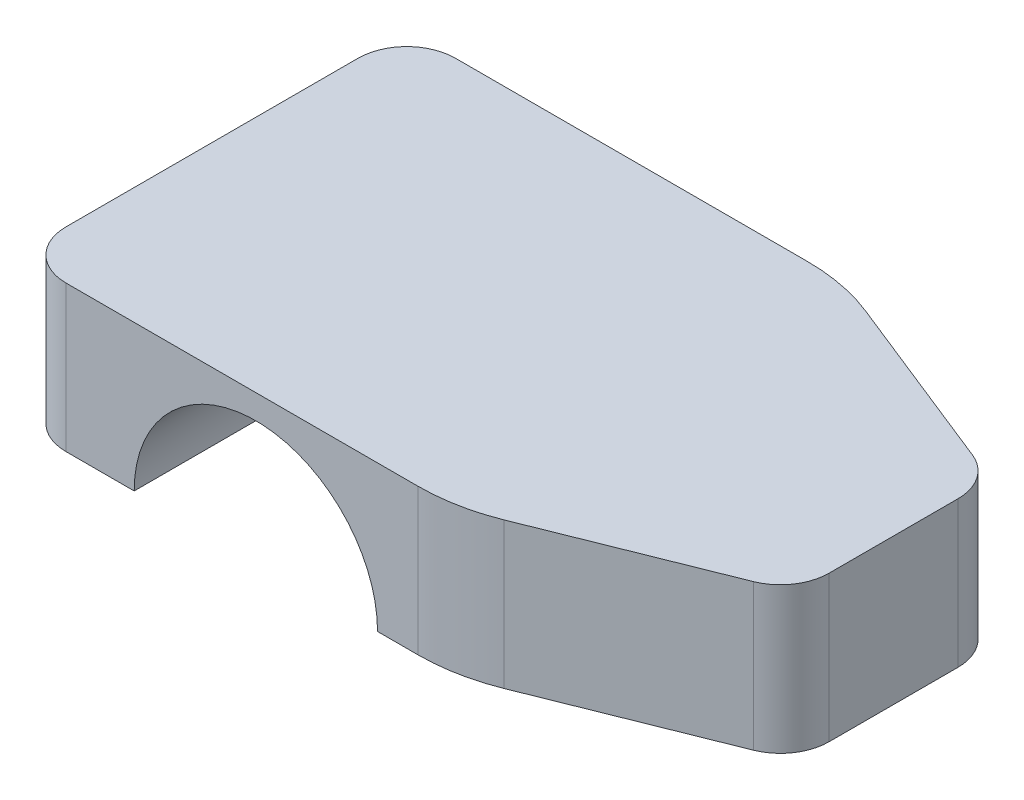
ISO-10303-21;
HEADER;
FILE_DESCRIPTION(('STEP AP214'),'2;1');
FILE_NAME('part.step','',(''),(''),'','','');
FILE_SCHEMA(('AUTOMOTIVE_DESIGN { 1 0 10303 214 1 1 1 1 }'));
ENDSEC;
DATA;
#1=APPLICATION_CONTEXT('core data for automotive mechanical design processes');
#2=APPLICATION_PROTOCOL_DEFINITION('international standard','automotive_design',2000,#1);
#3=PRODUCT_CONTEXT('',#1,'mechanical');
#4=PRODUCT('Part','Part','',(#3));
#5=PRODUCT_RELATED_PRODUCT_CATEGORY('part','',(#4));
#6=PRODUCT_DEFINITION_FORMATION('','',#4);
#7=PRODUCT_DEFINITION_CONTEXT('part definition',#1,'design');
#8=PRODUCT_DEFINITION('design','',#6,#7);
#9=PRODUCT_DEFINITION_SHAPE('','',#8);
#10=(LENGTH_UNIT() NAMED_UNIT(*) SI_UNIT(.MILLI.,.METRE.));
#11=(NAMED_UNIT(*) PLANE_ANGLE_UNIT() SI_UNIT($,.RADIAN.));
#12=(NAMED_UNIT(*) SI_UNIT($,.STERADIAN.) SOLID_ANGLE_UNIT());
#13=UNCERTAINTY_MEASURE_WITH_UNIT(LENGTH_MEASURE(1.E-05),#10,'distance_accuracy_value','');
#14=(GEOMETRIC_REPRESENTATION_CONTEXT(3) GLOBAL_UNCERTAINTY_ASSIGNED_CONTEXT((#13)) GLOBAL_UNIT_ASSIGNED_CONTEXT((#10,
#11,#12)) REPRESENTATION_CONTEXT('',''));
#15=CARTESIAN_POINT('',(0.,0.,0.));
#16=DIRECTION('',(0.,0.,1.));
#17=DIRECTION('',(1.,0.,0.));
#18=AXIS2_PLACEMENT_3D('',#15,#16,#17);
#19=CARTESIAN_POINT('',(0.,0.,0.));
#20=DIRECTION('',(0.,1.,0.));
#21=DIRECTION('',(0.,0.,1.));
#22=AXIS2_PLACEMENT_3D('',#19,#20,#21);
#23=PLANE('',#22);
#24=DIRECTION('',(1.,0.,0.));
#25=VECTOR('',#24,1.);
#26=CARTESIAN_POINT('',(-55.,0.,20.));
#27=LINE('',#26,#25);
#28=CARTESIAN_POINT('',(-50.,0.,20.));
#29=VERTEX_POINT('',#28);
#30=CARTESIAN_POINT('',(-43.,0.,20.));
#31=VERTEX_POINT('',#30);
#32=EDGE_CURVE('E158',#29,#31,#27,.T.);
#33=ORIENTED_EDGE('',*,*,#32,.F.);
#34=CARTESIAN_POINT('',(-50.,0.,15.));
#35=DIRECTION('',(0.,1.,0.));
#36=DIRECTION('',(0.,0.,1.));
#37=AXIS2_PLACEMENT_3D('',#34,#35,#36);
#38=CIRCLE('',#37,5.);
#39=CARTESIAN_POINT('',(-55.,0.,15.));
#40=VERTEX_POINT('',#39);
#41=EDGE_CURVE('E176',#29,#40,#38,.F.);
#42=ORIENTED_EDGE('',*,*,#41,.T.);
#43=DIRECTION('',(0.,0.,1.));
#44=VECTOR('',#43,1.);
#45=CARTESIAN_POINT('',(-55.,0.,-20.));
#46=LINE('',#45,#44);
#47=CARTESIAN_POINT('',(-55.,0.,-15.));
#48=VERTEX_POINT('',#47);
#49=EDGE_CURVE('E163',#48,#40,#46,.T.);
#50=ORIENTED_EDGE('',*,*,#49,.F.);
#51=CARTESIAN_POINT('',(-50.,0.,-15.));
#52=DIRECTION('',(0.,1.,0.));
#53=DIRECTION('',(0.,0.,1.));
#54=AXIS2_PLACEMENT_3D('',#51,#52,#53);
#55=CIRCLE('',#54,5.);
#56=CARTESIAN_POINT('',(-50.,0.,-20.));
#57=VERTEX_POINT('',#56);
#58=EDGE_CURVE('E174',#48,#57,#55,.F.);
#59=ORIENTED_EDGE('',*,*,#58,.T.);
#60=DIRECTION('',(-1.,0.,0.));
#61=VECTOR('',#60,1.);
#62=CARTESIAN_POINT('',(-55.,0.,-20.));
#63=LINE('',#62,#61);
#64=CARTESIAN_POINT('',(-43.,0.,-20.));
#65=VERTEX_POINT('',#64);
#66=EDGE_CURVE('E238',#65,#57,#63,.T.);
#67=ORIENTED_EDGE('',*,*,#66,.F.);
#68=DIRECTION('',(0.,0.,1.));
#69=VECTOR('',#68,1.);
#70=CARTESIAN_POINT('',(-43.,0.,-20.));
#71=LINE('',#70,#69);
#72=EDGE_CURVE('E151',#65,#31,#71,.T.);
#73=ORIENTED_EDGE('',*,*,#72,.T.);
#74=EDGE_LOOP('',(#33,#42,#50,#59,#67,#73));
#75=FACE_BOUND('',#74,.T.);
#76=ADVANCED_FACE('F39',(#75),#23,.F.);
#77=CARTESIAN_POINT('',(15.,15.,10.));
#78=DIRECTION('',(-0.371390676354103,0.,-0.928476690885259));
#79=DIRECTION('',(-0.92847669088526,0.,0.371390676354104));
#80=AXIS2_PLACEMENT_3D('',#77,#78,#79);
#81=PLANE('',#80);
#82=DIRECTION('',(0.928476690885259,0.,-0.371390676354103));
#83=VECTOR('',#82,1.);
#84=CARTESIAN_POINT('',(15.,15.,10.));
#85=LINE('',#84,#83);
#86=CARTESIAN_POINT('',(-6.42383454426297,15.,18.5695338177052));
#87=VERTEX_POINT('',#86);
#88=CARTESIAN_POINT('',(11.8569533817705,15.,11.2572186472918));
#89=VERTEX_POINT('',#88);
#90=EDGE_CURVE('E165',#87,#89,#85,.T.);
#91=ORIENTED_EDGE('',*,*,#90,.F.);
#92=DIRECTION('',(0.,-1.,0.));
#93=VECTOR('',#92,1.);
#94=CARTESIAN_POINT('',(-6.42383454426298,15.,18.5695338177052));
#95=LINE('',#94,#93);
#96=CARTESIAN_POINT('',(-6.42383454426297,0.,18.5695338177052));
#97=VERTEX_POINT('',#96);
#98=EDGE_CURVE('E47',#87,#97,#95,.T.);
#99=ORIENTED_EDGE('',*,*,#98,.T.);
#100=DIRECTION('',(0.928476690885259,0.,-0.371390676354103));
#101=VECTOR('',#100,1.);
#102=CARTESIAN_POINT('',(15.,0.,10.));
#103=LINE('',#102,#101);
#104=CARTESIAN_POINT('',(11.8569533817705,0.,11.2572186472918));
#105=VERTEX_POINT('',#104);
#106=EDGE_CURVE('E224',#97,#105,#103,.T.);
#107=ORIENTED_EDGE('',*,*,#106,.T.);
#108=DIRECTION('',(0.,-1.,0.));
#109=VECTOR('',#108,1.);
#110=CARTESIAN_POINT('',(11.8569533817705,15.,11.2572186472918));
#111=LINE('',#110,#109);
#112=EDGE_CURVE('E204',#105,#89,#111,.F.);
#113=ORIENTED_EDGE('',*,*,#112,.T.);
#114=EDGE_LOOP('',(#91,#99,#107,#113));
#115=FACE_BOUND('',#114,.T.);
#116=ADVANCED_FACE('F223',(#115),#81,.F.);
#117=CARTESIAN_POINT('',(15.,15.,-10.));
#118=DIRECTION('',(-1.,0.,0.));
#119=DIRECTION('',(0.,0.,1.));
#120=AXIS2_PLACEMENT_3D('',#117,#118,#119);
#121=PLANE('',#120);
#122=DIRECTION('',(0.,0.,-1.));
#123=VECTOR('',#122,1.);
#124=CARTESIAN_POINT('',(15.,0.,-10.));
#125=LINE('',#124,#123);
#126=CARTESIAN_POINT('',(15.,0.,6.61483519286549));
#127=VERTEX_POINT('',#126);
#128=CARTESIAN_POINT('',(15.,0.,-6.6148351928655));
#129=VERTEX_POINT('',#128);
#130=EDGE_CURVE('E228',#127,#129,#125,.T.);
#131=ORIENTED_EDGE('',*,*,#130,.T.);
#132=DIRECTION('',(0.,-1.,0.));
#133=VECTOR('',#132,1.);
#134=CARTESIAN_POINT('',(15.,15.,-6.6148351928655));
#135=LINE('',#134,#133);
#136=CARTESIAN_POINT('',(15.,15.,-6.6148351928655));
#137=VERTEX_POINT('',#136);
#138=EDGE_CURVE('E202',#129,#137,#135,.F.);
#139=ORIENTED_EDGE('',*,*,#138,.T.);
#140=DIRECTION('',(0.,0.,-1.));
#141=VECTOR('',#140,1.);
#142=CARTESIAN_POINT('',(15.,15.,-10.));
#143=LINE('',#142,#141);
#144=CARTESIAN_POINT('',(15.,15.,6.61483519286549));
#145=VERTEX_POINT('',#144);
#146=EDGE_CURVE('E265',#145,#137,#143,.T.);
#147=ORIENTED_EDGE('',*,*,#146,.F.);
#148=DIRECTION('',(0.,-1.,0.));
#149=VECTOR('',#148,1.);
#150=CARTESIAN_POINT('',(15.,15.,6.61483519286549));
#151=LINE('',#150,#149);
#152=EDGE_CURVE('E199',#145,#127,#151,.T.);
#153=ORIENTED_EDGE('',*,*,#152,.T.);
#154=EDGE_LOOP('',(#131,#139,#147,#153));
#155=FACE_BOUND('',#154,.T.);
#156=ADVANCED_FACE('F274',(#155),#121,.F.);
#157=CARTESIAN_POINT('',(-10.,15.,-20.));
#158=DIRECTION('',(-0.371390676354104,0.,0.928476690885259));
#159=DIRECTION('',(0.928476690885259,0.,0.371390676354104));
#160=AXIS2_PLACEMENT_3D('',#157,#158,#159);
#161=PLANE('',#160);
#162=DIRECTION('',(-0.928476690885259,0.,-0.371390676354104));
#163=VECTOR('',#162,1.);
#164=CARTESIAN_POINT('',(-10.,0.,-20.));
#165=LINE('',#164,#163);
#166=CARTESIAN_POINT('',(11.8569533817705,0.,-11.2572186472918));
#167=VERTEX_POINT('',#166);
#168=CARTESIAN_POINT('',(-6.42383454426299,0.,-18.5695338177052));
#169=VERTEX_POINT('',#168);
#170=EDGE_CURVE('E231',#167,#169,#165,.T.);
#171=ORIENTED_EDGE('',*,*,#170,.T.);
#172=DIRECTION('',(0.,-1.,0.));
#173=VECTOR('',#172,1.);
#174=CARTESIAN_POINT('',(-6.42383454426299,15.,-18.5695338177052));
#175=LINE('',#174,#173);
#176=CARTESIAN_POINT('',(-6.42383454426299,15.,-18.5695338177052));
#177=VERTEX_POINT('',#176);
#178=EDGE_CURVE('E216',#169,#177,#175,.F.);
#179=ORIENTED_EDGE('',*,*,#178,.T.);
#180=DIRECTION('',(-0.928476690885259,0.,-0.371390676354104));
#181=VECTOR('',#180,1.);
#182=CARTESIAN_POINT('',(-10.,15.,-20.));
#183=LINE('',#182,#181);
#184=CARTESIAN_POINT('',(11.8569533817705,15.,-11.2572186472918));
#185=VERTEX_POINT('',#184);
#186=EDGE_CURVE('E261',#185,#177,#183,.T.);
#187=ORIENTED_EDGE('',*,*,#186,.F.);
#188=DIRECTION('',(0.,-1.,0.));
#189=VECTOR('',#188,1.);
#190=CARTESIAN_POINT('',(11.8569533817705,15.,-11.2572186472918));
#191=LINE('',#190,#189);
#192=EDGE_CURVE('E191',#185,#167,#191,.T.);
#193=ORIENTED_EDGE('',*,*,#192,.T.);
#194=EDGE_LOOP('',(#171,#179,#187,#193));
#195=FACE_BOUND('',#194,.T.);
#196=ADVANCED_FACE('F283',(#195),#161,.F.);
#197=CARTESIAN_POINT('',(-55.,15.,-20.));
#198=DIRECTION('',(0.,0.,1.));
#199=DIRECTION('',(1.,0.,0.));
#200=AXIS2_PLACEMENT_3D('',#197,#198,#199);
#201=PLANE('',#200);
#202=DIRECTION('',(-1.,0.,0.));
#203=VECTOR('',#202,1.);
#204=CARTESIAN_POINT('',(-55.,15.,-20.));
#205=LINE('',#204,#203);
#206=CARTESIAN_POINT('',(-13.8516480713451,15.,-20.));
#207=VERTEX_POINT('',#206);
#208=CARTESIAN_POINT('',(-50.,15.,-20.));
#209=VERTEX_POINT('',#208);
#210=EDGE_CURVE('E256',#207,#209,#205,.T.);
#211=ORIENTED_EDGE('',*,*,#210,.F.);
#212=DIRECTION('',(0.,-1.,0.));
#213=VECTOR('',#212,1.);
#214=CARTESIAN_POINT('',(-13.8516480713451,15.,-20.));
#215=LINE('',#214,#213);
#216=CARTESIAN_POINT('',(-13.8516480713451,0.,-20.));
#217=VERTEX_POINT('',#216);
#218=EDGE_CURVE('E210',#207,#217,#215,.T.);
#219=ORIENTED_EDGE('',*,*,#218,.T.);
#220=CARTESIAN_POINT('',(-18.,0.,-20.));
#221=VERTEX_POINT('',#220);
#222=EDGE_CURVE('E167',#217,#221,#63,.T.);
#223=ORIENTED_EDGE('',*,*,#222,.T.);
#224=CARTESIAN_POINT('',(-30.5,0.,-20.));
#225=DIRECTION('',(0.,0.,1.));
#226=DIRECTION('',(1.,0.,0.));
#227=AXIS2_PLACEMENT_3D('',#224,#225,#226);
#228=CIRCLE('',#227,12.5);
#229=EDGE_CURVE('E147',#221,#65,#228,.T.);
#230=ORIENTED_EDGE('',*,*,#229,.T.);
#231=ORIENTED_EDGE('',*,*,#66,.T.);
#232=DIRECTION('',(0.,-1.,0.));
#233=VECTOR('',#232,1.);
#234=CARTESIAN_POINT('',(-50.,15.,-20.));
#235=LINE('',#234,#233);
#236=EDGE_CURVE('E207',#57,#209,#235,.F.);
#237=ORIENTED_EDGE('',*,*,#236,.T.);
#238=EDGE_LOOP('',(#211,#219,#223,#230,#231,#237));
#239=FACE_BOUND('',#238,.T.);
#240=ADVANCED_FACE('F244',(#239),#201,.F.);
#241=CARTESIAN_POINT('',(-55.,15.,-20.));
#242=DIRECTION('',(1.,0.,0.));
#243=DIRECTION('',(0.,0.,-1.));
#244=AXIS2_PLACEMENT_3D('',#241,#242,#243);
#245=PLANE('',#244);
#246=ORIENTED_EDGE('',*,*,#49,.T.);
#247=DIRECTION('',(0.,-1.,0.));
#248=VECTOR('',#247,1.);
#249=CARTESIAN_POINT('',(-55.,15.,15.));
#250=LINE('',#249,#248);
#251=CARTESIAN_POINT('',(-55.,15.,15.));
#252=VERTEX_POINT('',#251);
#253=EDGE_CURVE('E181',#40,#252,#250,.F.);
#254=ORIENTED_EDGE('',*,*,#253,.T.);
#255=DIRECTION('',(0.,0.,1.));
#256=VECTOR('',#255,1.);
#257=CARTESIAN_POINT('',(-55.,15.,-20.));
#258=LINE('',#257,#256);
#259=CARTESIAN_POINT('',(-55.,15.,-15.));
#260=VERTEX_POINT('',#259);
#261=EDGE_CURVE('E254',#260,#252,#258,.T.);
#262=ORIENTED_EDGE('',*,*,#261,.F.);
#263=DIRECTION('',(0.,-1.,0.));
#264=VECTOR('',#263,1.);
#265=CARTESIAN_POINT('',(-55.,15.,-15.));
#266=LINE('',#265,#264);
#267=EDGE_CURVE('E178',#260,#48,#266,.T.);
#268=ORIENTED_EDGE('',*,*,#267,.T.);
#269=EDGE_LOOP('',(#246,#254,#262,#268));
#270=FACE_BOUND('',#269,.T.);
#271=ADVANCED_FACE('F258',(#270),#245,.F.);
#272=CARTESIAN_POINT('',(-55.,15.,20.));
#273=DIRECTION('',(0.,0.,-1.));
#274=DIRECTION('',(-1.,0.,0.));
#275=AXIS2_PLACEMENT_3D('',#272,#273,#274);
#276=PLANE('',#275);
#277=CARTESIAN_POINT('',(-18.,0.,20.));
#278=VERTEX_POINT('',#277);
#279=CARTESIAN_POINT('',(-13.8516480713451,0.,20.));
#280=VERTEX_POINT('',#279);
#281=EDGE_CURVE('E155',#278,#280,#27,.T.);
#282=ORIENTED_EDGE('',*,*,#281,.T.);
#283=DIRECTION('',(0.,-1.,0.));
#284=VECTOR('',#283,1.);
#285=CARTESIAN_POINT('',(-13.851648071345,15.,20.));
#286=LINE('',#285,#284);
#287=CARTESIAN_POINT('',(-13.8516480713451,15.,20.));
#288=VERTEX_POINT('',#287);
#289=EDGE_CURVE('E11',#280,#288,#286,.F.);
#290=ORIENTED_EDGE('',*,*,#289,.T.);
#291=DIRECTION('',(1.,0.,0.));
#292=VECTOR('',#291,1.);
#293=CARTESIAN_POINT('',(-55.,15.,20.));
#294=LINE('',#293,#292);
#295=CARTESIAN_POINT('',(-50.,15.,20.));
#296=VERTEX_POINT('',#295);
#297=EDGE_CURVE('E152',#296,#288,#294,.T.);
#298=ORIENTED_EDGE('',*,*,#297,.F.);
#299=DIRECTION('',(0.,-1.,0.));
#300=VECTOR('',#299,1.);
#301=CARTESIAN_POINT('',(-50.,15.,20.));
#302=LINE('',#301,#300);
#303=EDGE_CURVE('E172',#296,#29,#302,.T.);
#304=ORIENTED_EDGE('',*,*,#303,.T.);
#305=ORIENTED_EDGE('',*,*,#32,.T.);
#306=CARTESIAN_POINT('',(-30.5,0.,20.));
#307=DIRECTION('',(0.,0.,1.));
#308=DIRECTION('',(1.,0.,0.));
#309=AXIS2_PLACEMENT_3D('',#306,#307,#308);
#310=CIRCLE('',#309,12.5);
#311=EDGE_CURVE('E144',#278,#31,#310,.T.);
#312=ORIENTED_EDGE('',*,*,#311,.F.);
#313=EDGE_LOOP('',(#282,#290,#298,#304,#305,#312));
#314=FACE_BOUND('',#313,.T.);
#315=ADVANCED_FACE('F154',(#314),#276,.F.);
#316=CARTESIAN_POINT('',(0.,15.,0.));
#317=DIRECTION('',(0.,1.,0.));
#318=DIRECTION('',(0.,0.,1.));
#319=AXIS2_PLACEMENT_3D('',#316,#317,#318);
#320=PLANE('',#319);
#321=ORIENTED_EDGE('',*,*,#186,.T.);
#322=CARTESIAN_POINT('',(-13.8516480713451,15.,0.));
#323=DIRECTION('',(0.,1.,0.));
#324=DIRECTION('',(0.,0.,1.));
#325=AXIS2_PLACEMENT_3D('',#322,#323,#324);
#326=CIRCLE('',#325,20.);
#327=EDGE_CURVE('E219',#177,#207,#326,.T.);
#328=ORIENTED_EDGE('',*,*,#327,.T.);
#329=ORIENTED_EDGE('',*,*,#210,.T.);
#330=CARTESIAN_POINT('',(-50.,15.,-15.));
#331=DIRECTION('',(0.,1.,0.));
#332=DIRECTION('',(0.,0.,1.));
#333=AXIS2_PLACEMENT_3D('',#330,#331,#332);
#334=CIRCLE('',#333,5.);
#335=EDGE_CURVE('E183',#209,#260,#334,.T.);
#336=ORIENTED_EDGE('',*,*,#335,.T.);
#337=ORIENTED_EDGE('',*,*,#261,.T.);
#338=CARTESIAN_POINT('',(-50.,15.,15.));
#339=DIRECTION('',(0.,1.,0.));
#340=DIRECTION('',(0.,0.,1.));
#341=AXIS2_PLACEMENT_3D('',#338,#339,#340);
#342=CIRCLE('',#341,5.);
#343=EDGE_CURVE('E189',#252,#296,#342,.T.);
#344=ORIENTED_EDGE('',*,*,#343,.T.);
#345=ORIENTED_EDGE('',*,*,#297,.T.);
#346=CARTESIAN_POINT('',(-13.851648071345,15.,0.));
#347=DIRECTION('',(0.,1.,0.));
#348=DIRECTION('',(0.,0.,1.));
#349=AXIS2_PLACEMENT_3D('',#346,#347,#348);
#350=CIRCLE('',#349,20.);
#351=EDGE_CURVE('E54',#288,#87,#350,.T.);
#352=ORIENTED_EDGE('',*,*,#351,.T.);
#353=ORIENTED_EDGE('',*,*,#90,.T.);
#354=CARTESIAN_POINT('',(10.,15.,6.61483519286549));
#355=DIRECTION('',(0.,1.,0.));
#356=DIRECTION('',(0.,0.,1.));
#357=AXIS2_PLACEMENT_3D('',#354,#355,#356);
#358=CIRCLE('',#357,5.);
#359=EDGE_CURVE('E185',#89,#145,#358,.T.);
#360=ORIENTED_EDGE('',*,*,#359,.T.);
#361=ORIENTED_EDGE('',*,*,#146,.T.);
#362=CARTESIAN_POINT('',(10.,15.,-6.6148351928655));
#363=DIRECTION('',(0.,1.,0.));
#364=DIRECTION('',(0.,0.,1.));
#365=AXIS2_PLACEMENT_3D('',#362,#363,#364);
#366=CIRCLE('',#365,5.);
#367=EDGE_CURVE('E187',#137,#185,#366,.T.);
#368=ORIENTED_EDGE('',*,*,#367,.T.);
#369=EDGE_LOOP('',(#321,#328,#329,#336,#337,#344,#345,#352,#353,#360,#361,#368));
#370=FACE_BOUND('',#369,.T.);
#371=ADVANCED_FACE('F253',(#370),#320,.T.);
#372=ORIENTED_EDGE('',*,*,#222,.F.);
#373=CARTESIAN_POINT('',(-13.8516480713451,0.,0.));
#374=DIRECTION('',(0.,1.,0.));
#375=DIRECTION('',(0.,0.,1.));
#376=AXIS2_PLACEMENT_3D('',#373,#374,#375);
#377=CIRCLE('',#376,20.);
#378=EDGE_CURVE('E214',#217,#169,#377,.F.);
#379=ORIENTED_EDGE('',*,*,#378,.T.);
#380=ORIENTED_EDGE('',*,*,#170,.F.);
#381=CARTESIAN_POINT('',(10.,0.,-6.6148351928655));
#382=DIRECTION('',(0.,1.,0.));
#383=DIRECTION('',(0.,0.,1.));
#384=AXIS2_PLACEMENT_3D('',#381,#382,#383);
#385=CIRCLE('',#384,5.);
#386=EDGE_CURVE('E197',#167,#129,#385,.F.);
#387=ORIENTED_EDGE('',*,*,#386,.T.);
#388=ORIENTED_EDGE('',*,*,#130,.F.);
#389=CARTESIAN_POINT('',(10.,0.,6.61483519286549));
#390=DIRECTION('',(0.,1.,0.));
#391=DIRECTION('',(0.,0.,1.));
#392=AXIS2_PLACEMENT_3D('',#389,#390,#391);
#393=CIRCLE('',#392,5.);
#394=EDGE_CURVE('E194',#127,#105,#393,.F.);
#395=ORIENTED_EDGE('',*,*,#394,.T.);
#396=ORIENTED_EDGE('',*,*,#106,.F.);
#397=CARTESIAN_POINT('',(-13.851648071345,0.,0.));
#398=DIRECTION('',(0.,1.,0.));
#399=DIRECTION('',(0.,0.,1.));
#400=AXIS2_PLACEMENT_3D('',#397,#398,#399);
#401=CIRCLE('',#400,20.);
#402=EDGE_CURVE('E162',#97,#280,#401,.F.);
#403=ORIENTED_EDGE('',*,*,#402,.T.);
#404=ORIENTED_EDGE('',*,*,#281,.F.);
#405=DIRECTION('',(0.,0.,1.));
#406=VECTOR('',#405,1.);
#407=CARTESIAN_POINT('',(-18.,0.,-20.));
#408=LINE('',#407,#406);
#409=EDGE_CURVE('E141',#278,#221,#408,.F.);
#410=ORIENTED_EDGE('',*,*,#409,.T.);
#411=EDGE_LOOP('',(#372,#379,#380,#387,#388,#395,#396,#403,#404,#410));
#412=FACE_BOUND('',#411,.T.);
#413=ADVANCED_FACE('F160',(#412),#23,.F.);
#414=CARTESIAN_POINT('',(-30.5,0.,-20.));
#415=DIRECTION('',(0.,0.,1.));
#416=DIRECTION('',(1.,0.,0.));
#417=AXIS2_PLACEMENT_3D('',#414,#415,#416);
#418=CYLINDRICAL_SURFACE('',#417,12.5);
#419=ORIENTED_EDGE('',*,*,#229,.F.);
#420=ORIENTED_EDGE('',*,*,#409,.F.);
#421=ORIENTED_EDGE('',*,*,#311,.T.);
#422=ORIENTED_EDGE('',*,*,#72,.F.);
#423=EDGE_LOOP('',(#419,#420,#421,#422));
#424=FACE_BOUND('',#423,.T.);
#425=ADVANCED_FACE('F143',(#424),#418,.F.);
#426=CARTESIAN_POINT('',(-50.,15.,15.));
#427=DIRECTION('',(0.,-1.,0.));
#428=DIRECTION('',(0.,0.,-1.));
#429=AXIS2_PLACEMENT_3D('',#426,#427,#428);
#430=CYLINDRICAL_SURFACE('',#429,5.);
#431=ORIENTED_EDGE('',*,*,#343,.F.);
#432=ORIENTED_EDGE('',*,*,#253,.F.);
#433=ORIENTED_EDGE('',*,*,#41,.F.);
#434=ORIENTED_EDGE('',*,*,#303,.F.);
#435=EDGE_LOOP('',(#431,#432,#433,#434));
#436=FACE_BOUND('',#435,.T.);
#437=ADVANCED_FACE('F309',(#436),#430,.T.);
#438=CARTESIAN_POINT('',(10.,15.,-6.6148351928655));
#439=DIRECTION('',(0.,-1.,0.));
#440=DIRECTION('',(0.,0.,-1.));
#441=AXIS2_PLACEMENT_3D('',#438,#439,#440);
#442=CYLINDRICAL_SURFACE('',#441,5.);
#443=ORIENTED_EDGE('',*,*,#367,.F.);
#444=ORIENTED_EDGE('',*,*,#138,.F.);
#445=ORIENTED_EDGE('',*,*,#386,.F.);
#446=ORIENTED_EDGE('',*,*,#192,.F.);
#447=EDGE_LOOP('',(#443,#444,#445,#446));
#448=FACE_BOUND('',#447,.T.);
#449=ADVANCED_FACE('F280',(#448),#442,.T.);
#450=CARTESIAN_POINT('',(10.,15.,6.61483519286549));
#451=DIRECTION('',(0.,-1.,0.));
#452=DIRECTION('',(0.,0.,-1.));
#453=AXIS2_PLACEMENT_3D('',#450,#451,#452);
#454=CYLINDRICAL_SURFACE('',#453,5.);
#455=ORIENTED_EDGE('',*,*,#359,.F.);
#456=ORIENTED_EDGE('',*,*,#112,.F.);
#457=ORIENTED_EDGE('',*,*,#394,.F.);
#458=ORIENTED_EDGE('',*,*,#152,.F.);
#459=EDGE_LOOP('',(#455,#456,#457,#458));
#460=FACE_BOUND('',#459,.T.);
#461=ADVANCED_FACE('F272',(#460),#454,.T.);
#462=CARTESIAN_POINT('',(-50.,15.,-15.));
#463=DIRECTION('',(0.,-1.,0.));
#464=DIRECTION('',(0.,0.,-1.));
#465=AXIS2_PLACEMENT_3D('',#462,#463,#464);
#466=CYLINDRICAL_SURFACE('',#465,5.);
#467=ORIENTED_EDGE('',*,*,#335,.F.);
#468=ORIENTED_EDGE('',*,*,#236,.F.);
#469=ORIENTED_EDGE('',*,*,#58,.F.);
#470=ORIENTED_EDGE('',*,*,#267,.F.);
#471=EDGE_LOOP('',(#467,#468,#469,#470));
#472=FACE_BOUND('',#471,.T.);
#473=ADVANCED_FACE('F248',(#472),#466,.T.);
#474=CARTESIAN_POINT('',(-13.8516480713451,15.,0.));
#475=DIRECTION('',(0.,-1.,0.));
#476=DIRECTION('',(0.,0.,-1.));
#477=AXIS2_PLACEMENT_3D('',#474,#475,#476);
#478=CYLINDRICAL_SURFACE('',#477,20.);
#479=ORIENTED_EDGE('',*,*,#327,.F.);
#480=ORIENTED_EDGE('',*,*,#178,.F.);
#481=ORIENTED_EDGE('',*,*,#378,.F.);
#482=ORIENTED_EDGE('',*,*,#218,.F.);
#483=EDGE_LOOP('',(#479,#480,#481,#482));
#484=FACE_BOUND('',#483,.T.);
#485=ADVANCED_FACE('F288',(#484),#478,.T.);
#486=CARTESIAN_POINT('',(-13.851648071345,15.,0.));
#487=DIRECTION('',(0.,-1.,0.));
#488=DIRECTION('',(0.,0.,-1.));
#489=AXIS2_PLACEMENT_3D('',#486,#487,#488);
#490=CYLINDRICAL_SURFACE('',#489,20.);
#491=ORIENTED_EDGE('',*,*,#351,.F.);
#492=ORIENTED_EDGE('',*,*,#289,.F.);
#493=ORIENTED_EDGE('',*,*,#402,.F.);
#494=ORIENTED_EDGE('',*,*,#98,.F.);
#495=EDGE_LOOP('',(#491,#492,#493,#494));
#496=FACE_BOUND('',#495,.T.);
#497=ADVANCED_FACE('F41',(#496),#490,.T.);
#498=CLOSED_SHELL('',(#76,#116,#156,#196,#240,#271,#315,#371,#413,#425,#437,#449,#461,#473,#485,#497));
#499=MANIFOLD_SOLID_BREP('B2',#498);
#500=ADVANCED_BREP_SHAPE_REPRESENTATION('',(#18,#499),#14);
#501=SHAPE_DEFINITION_REPRESENTATION(#9,#500);
ENDSEC;
END-ISO-10303-21;
